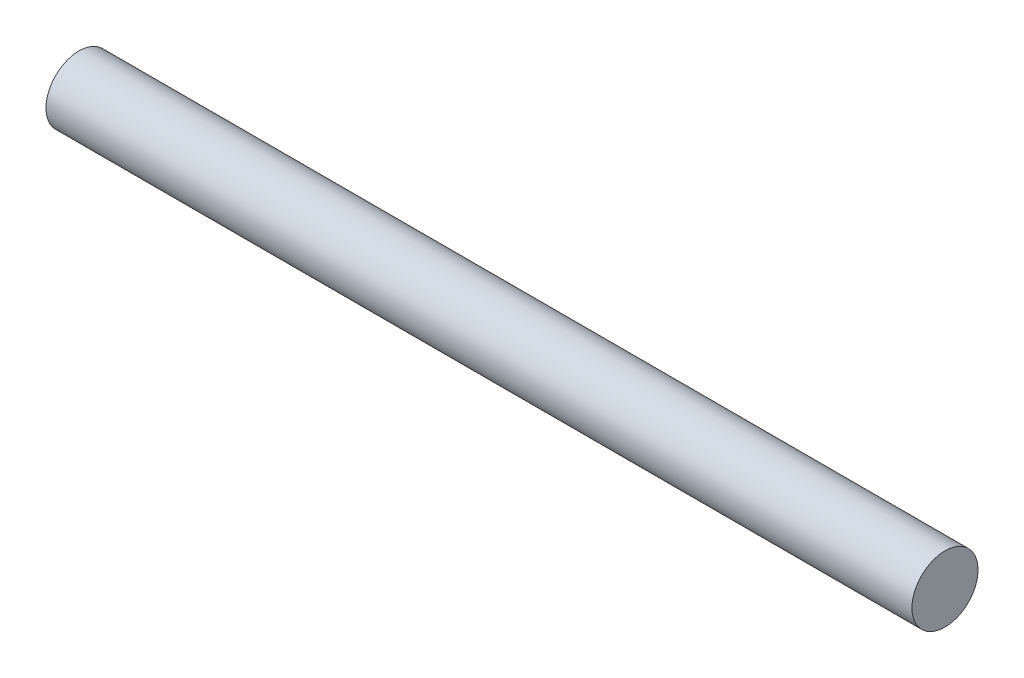
ISO-10303-21;
HEADER;
FILE_DESCRIPTION(('STEP AP214'),'2;1');
FILE_NAME('part.step','',(''),(''),'','','');
FILE_SCHEMA(('AUTOMOTIVE_DESIGN { 1 0 10303 214 1 1 1 1 }'));
ENDSEC;
DATA;
#1=APPLICATION_CONTEXT('core data for automotive mechanical design processes');
#2=APPLICATION_PROTOCOL_DEFINITION('international standard','automotive_design',2000,#1);
#3=PRODUCT_CONTEXT('',#1,'mechanical');
#4=PRODUCT('Part','Part','',(#3));
#5=PRODUCT_RELATED_PRODUCT_CATEGORY('part','',(#4));
#6=PRODUCT_DEFINITION_FORMATION('','',#4);
#7=PRODUCT_DEFINITION_CONTEXT('part definition',#1,'design');
#8=PRODUCT_DEFINITION('design','',#6,#7);
#9=PRODUCT_DEFINITION_SHAPE('','',#8);
#10=(LENGTH_UNIT() NAMED_UNIT(*) SI_UNIT(.MILLI.,.METRE.));
#11=(NAMED_UNIT(*) PLANE_ANGLE_UNIT() SI_UNIT($,.RADIAN.));
#12=(NAMED_UNIT(*) SI_UNIT($,.STERADIAN.) SOLID_ANGLE_UNIT());
#13=UNCERTAINTY_MEASURE_WITH_UNIT(LENGTH_MEASURE(1.E-05),#10,'distance_accuracy_value','');
#14=(GEOMETRIC_REPRESENTATION_CONTEXT(3) GLOBAL_UNCERTAINTY_ASSIGNED_CONTEXT((#13)) GLOBAL_UNIT_ASSIGNED_CONTEXT((#10,
#11,#12)) REPRESENTATION_CONTEXT('',''));
#15=CARTESIAN_POINT('',(0.,0.,0.));
#16=DIRECTION('',(0.,0.,1.));
#17=DIRECTION('',(1.,0.,0.));
#18=AXIS2_PLACEMENT_3D('',#15,#16,#17);
#19=CARTESIAN_POINT('',(52.,0.,0.));
#20=DIRECTION('',(-1.,0.,0.));
#21=DIRECTION('',(0.,0.,1.));
#22=AXIS2_PLACEMENT_3D('',#19,#20,#21);
#23=CYLINDRICAL_SURFACE('',#22,1.985);
#24=CARTESIAN_POINT('',(52.,0.,0.));
#25=DIRECTION('',(1.,0.,0.));
#26=DIRECTION('',(0.,0.,-1.));
#27=AXIS2_PLACEMENT_3D('',#24,#25,#26);
#28=CIRCLE('',#27,1.985);
#29=CARTESIAN_POINT('',(52.,0.,1.985));
#30=VERTEX_POINT('',#29);
#31=EDGE_CURVE('E10',#30,#30,#28,.T.);
#32=CARTESIAN_POINT('',(0.,0.,0.));
#33=DIRECTION('',(1.,0.,0.));
#34=DIRECTION('',(0.,0.,-1.));
#35=AXIS2_PLACEMENT_3D('',#32,#33,#34);
#36=CIRCLE('',#35,1.985);
#37=CARTESIAN_POINT('',(0.,0.,1.985));
#38=VERTEX_POINT('',#37);
#39=EDGE_CURVE('E42',#38,#38,#36,.T.);
#40=CARTESIAN_POINT('',(52.,0.,1.985));
#41=CARTESIAN_POINT('',(51.4583333333333,0.,1.985));
#42=CARTESIAN_POINT('',(50.9166666666667,0.,1.985));
#43=CARTESIAN_POINT('',(49.8333333333333,0.,1.985));
#44=CARTESIAN_POINT('',(49.2916666666667,0.,1.985));
#45=CARTESIAN_POINT('',(48.2083333333333,0.,1.985));
#46=CARTESIAN_POINT('',(47.6666666666667,0.,1.985));
#47=CARTESIAN_POINT('',(46.5833333333333,0.,1.985));
#48=CARTESIAN_POINT('',(46.0416666666667,0.,1.985));
#49=CARTESIAN_POINT('',(44.9583333333333,0.,1.985));
#50=CARTESIAN_POINT('',(44.4166666666667,0.,1.985));
#51=CARTESIAN_POINT('',(43.3333333333333,0.,1.985));
#52=CARTESIAN_POINT('',(42.7916666666667,0.,1.985));
#53=CARTESIAN_POINT('',(41.7083333333333,0.,1.985));
#54=CARTESIAN_POINT('',(41.1666666666667,0.,1.985));
#55=CARTESIAN_POINT('',(40.0833333333333,0.,1.985));
#56=CARTESIAN_POINT('',(39.5416666666667,0.,1.985));
#57=CARTESIAN_POINT('',(38.4583333333333,0.,1.985));
#58=CARTESIAN_POINT('',(37.9166666666667,0.,1.985));
#59=CARTESIAN_POINT('',(36.8333333333333,0.,1.985));
#60=CARTESIAN_POINT('',(36.2916666666667,0.,1.985));
#61=CARTESIAN_POINT('',(35.2083333333333,0.,1.985));
#62=CARTESIAN_POINT('',(34.6666666666667,0.,1.985));
#63=CARTESIAN_POINT('',(33.5833333333333,0.,1.985));
#64=CARTESIAN_POINT('',(33.0416666666667,0.,1.985));
#65=CARTESIAN_POINT('',(31.9583333333333,0.,1.985));
#66=CARTESIAN_POINT('',(31.4166666666667,0.,1.985));
#67=CARTESIAN_POINT('',(30.3333333333333,0.,1.985));
#68=CARTESIAN_POINT('',(29.7916666666667,0.,1.985));
#69=CARTESIAN_POINT('',(28.7083333333333,0.,1.985));
#70=CARTESIAN_POINT('',(28.1666666666667,0.,1.985));
#71=CARTESIAN_POINT('',(27.0833333333333,0.,1.985));
#72=CARTESIAN_POINT('',(26.5416666666667,0.,1.985));
#73=CARTESIAN_POINT('',(25.4583333333333,0.,1.985));
#74=CARTESIAN_POINT('',(24.9166666666667,0.,1.985));
#75=CARTESIAN_POINT('',(23.8333333333333,0.,1.985));
#76=CARTESIAN_POINT('',(23.2916666666667,0.,1.985));
#77=CARTESIAN_POINT('',(22.2083333333333,0.,1.985));
#78=CARTESIAN_POINT('',(21.6666666666667,0.,1.985));
#79=CARTESIAN_POINT('',(20.5833333333333,0.,1.985));
#80=CARTESIAN_POINT('',(20.0416666666667,0.,1.985));
#81=CARTESIAN_POINT('',(18.9583333333333,0.,1.985));
#82=CARTESIAN_POINT('',(18.4166666666667,0.,1.985));
#83=CARTESIAN_POINT('',(17.3333333333333,0.,1.985));
#84=CARTESIAN_POINT('',(16.7916666666667,0.,1.985));
#85=CARTESIAN_POINT('',(15.7083333333333,0.,1.985));
#86=CARTESIAN_POINT('',(15.1666666666667,0.,1.985));
#87=CARTESIAN_POINT('',(14.0833333333333,0.,1.985));
#88=CARTESIAN_POINT('',(13.5416666666667,0.,1.985));
#89=CARTESIAN_POINT('',(12.4583333333333,0.,1.985));
#90=CARTESIAN_POINT('',(11.9166666666667,0.,1.985));
#91=CARTESIAN_POINT('',(10.8333333333333,0.,1.985));
#92=CARTESIAN_POINT('',(10.2916666666667,0.,1.985));
#93=CARTESIAN_POINT('',(9.20833333333333,0.,1.985));
#94=CARTESIAN_POINT('',(8.66666666666667,0.,1.985));
#95=CARTESIAN_POINT('',(7.58333333333333,0.,1.985));
#96=CARTESIAN_POINT('',(7.04166666666667,0.,1.985));
#97=CARTESIAN_POINT('',(5.95833333333333,0.,1.985));
#98=CARTESIAN_POINT('',(5.41666666666667,0.,1.985));
#99=CARTESIAN_POINT('',(4.33333333333333,0.,1.985));
#100=CARTESIAN_POINT('',(3.79166666666667,0.,1.985));
#101=CARTESIAN_POINT('',(2.70833333333334,0.,1.985));
#102=CARTESIAN_POINT('',(2.16666666666667,0.,1.985));
#103=CARTESIAN_POINT('',(1.08333333333333,0.,1.985));
#104=CARTESIAN_POINT('',(0.541666666666667,0.,1.985));
#105=CARTESIAN_POINT('',(0.,0.,1.985));
#106=B_SPLINE_CURVE_WITH_KNOTS('',3,(#40,#41,#42,#43,#44,#45,#46,#47,#48,#49,#50,#51,#52,#53,
#54,#55,#56,#57,#58,#59,#60,#61,#62,#63,#64,#65,#66,#67,#68,#69,#70,#71,#72,#73,#74,#75,#76,#77,
#78,#79,#80,#81,#82,#83,#84,#85,#86,#87,#88,#89,#90,#91,#92,#93,#94,#95,#96,#97,#98,#99,#100,
#101,#102,#103,#104,#105),.UNSPECIFIED.,.F.,.F.,(4,2,2,2,2,2,2,2,2,2,2,2,2,2,2,2,2,2,2,2,2,2,2,
2,2,2,2,2,2,2,2,2,4),(0.,1.625,3.25,4.875,6.50000000000001,8.125,9.75,11.375,13.,14.625,16.25,
17.875,19.5,21.125,22.75,24.375,26.,27.625,29.25,30.875,32.5,34.125,35.75,37.375,39.,40.625,
42.25,43.875,45.5,47.125,48.75,50.375,52.),.UNSPECIFIED.);
#107=EDGE_CURVE('BSEAM39',#30,#38,#106,.T.);
#108=ORIENTED_EDGE('',*,*,#31,.F.);
#109=ORIENTED_EDGE('',*,*,#39,.T.);
#110=ORIENTED_EDGE('',*,*,#107,.T.);
#111=ORIENTED_EDGE('',*,*,#107,.F.);
#112=EDGE_LOOP('',(#108,#110,#109,#111));
#113=FACE_BOUND('',#112,.T.);
#114=ADVANCED_FACE('F39',(#113),#23,.T.);
#115=CARTESIAN_POINT('',(52.,0.,0.));
#116=DIRECTION('',(1.,0.,0.));
#117=DIRECTION('',(0.,0.,-1.));
#118=AXIS2_PLACEMENT_3D('',#115,#116,#117);
#119=PLANE('',#118);
#120=ORIENTED_EDGE('',*,*,#31,.T.);
#121=EDGE_LOOP('',(#120));
#122=FACE_BOUND('',#121,.T.);
#123=ADVANCED_FACE('F54',(#122),#119,.T.);
#124=CARTESIAN_POINT('',(0.,0.,0.));
#125=DIRECTION('',(1.,0.,0.));
#126=DIRECTION('',(0.,0.,-1.));
#127=AXIS2_PLACEMENT_3D('',#124,#125,#126);
#128=PLANE('',#127);
#129=ORIENTED_EDGE('',*,*,#39,.F.);
#130=EDGE_LOOP('',(#129));
#131=FACE_BOUND('',#130,.T.);
#132=ADVANCED_FACE('F52',(#131),#128,.F.);
#133=CLOSED_SHELL('',(#114,#123,#132));
#134=MANIFOLD_SOLID_BREP('B2',#133);
#135=ADVANCED_BREP_SHAPE_REPRESENTATION('',(#18,#134),#14);
#136=SHAPE_DEFINITION_REPRESENTATION(#9,#135);
ENDSEC;
END-ISO-10303-21;
